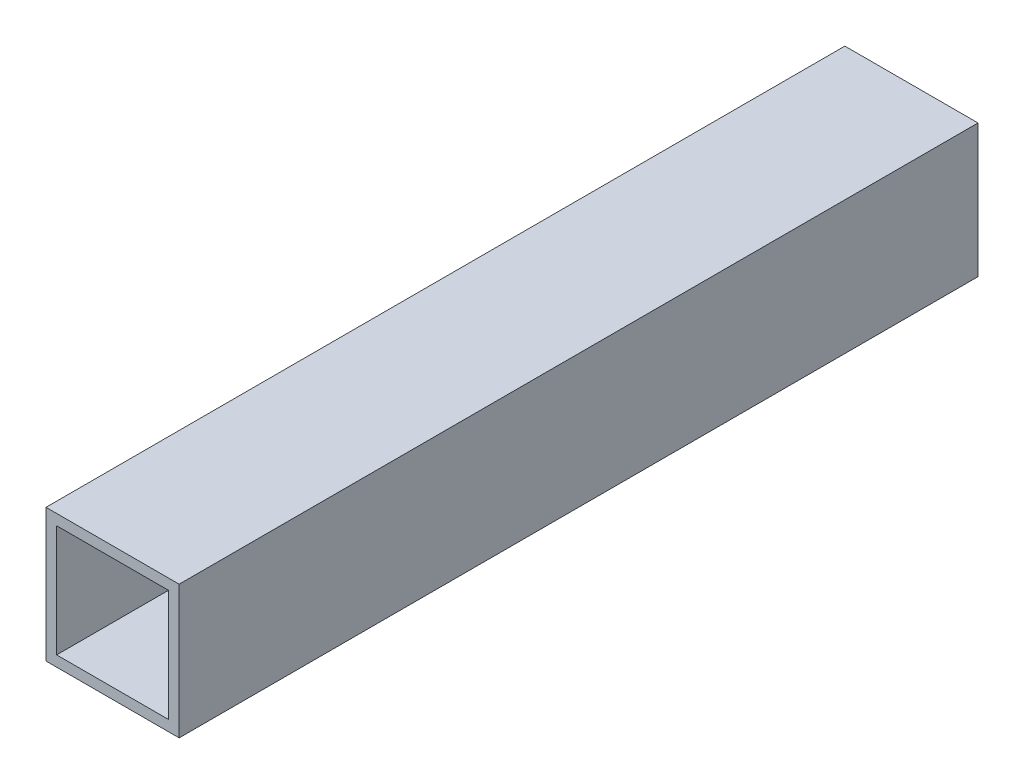
ISO-10303-21;
HEADER;
FILE_DESCRIPTION(('STEP AP214'),'2;1');
FILE_NAME('part.step','',(''),(''),'','','');
FILE_SCHEMA(('AUTOMOTIVE_DESIGN { 1 0 10303 214 1 1 1 1 }'));
ENDSEC;
DATA;
#1=APPLICATION_CONTEXT('core data for automotive mechanical design processes');
#2=APPLICATION_PROTOCOL_DEFINITION('international standard','automotive_design',2000,#1);
#3=PRODUCT_CONTEXT('',#1,'mechanical');
#4=PRODUCT('Part','Part','',(#3));
#5=PRODUCT_RELATED_PRODUCT_CATEGORY('part','',(#4));
#6=PRODUCT_DEFINITION_FORMATION('','',#4);
#7=PRODUCT_DEFINITION_CONTEXT('part definition',#1,'design');
#8=PRODUCT_DEFINITION('design','',#6,#7);
#9=PRODUCT_DEFINITION_SHAPE('','',#8);
#10=(LENGTH_UNIT() NAMED_UNIT(*) SI_UNIT(.MILLI.,.METRE.));
#11=(NAMED_UNIT(*) PLANE_ANGLE_UNIT() SI_UNIT($,.RADIAN.));
#12=(NAMED_UNIT(*) SI_UNIT($,.STERADIAN.) SOLID_ANGLE_UNIT());
#13=UNCERTAINTY_MEASURE_WITH_UNIT(LENGTH_MEASURE(1.E-05),#10,'distance_accuracy_value','');
#14=(GEOMETRIC_REPRESENTATION_CONTEXT(3) GLOBAL_UNCERTAINTY_ASSIGNED_CONTEXT((#13)) GLOBAL_UNIT_ASSIGNED_CONTEXT((#10,
#11,#12)) REPRESENTATION_CONTEXT('',''));
#15=CARTESIAN_POINT('',(0.,0.,0.));
#16=DIRECTION('',(0.,0.,1.));
#17=DIRECTION('',(1.,0.,0.));
#18=AXIS2_PLACEMENT_3D('',#15,#16,#17);
#19=CARTESIAN_POINT('',(0.,0.,150.));
#20=DIRECTION('',(0.,0.,1.));
#21=DIRECTION('',(1.,0.,0.));
#22=AXIS2_PLACEMENT_3D('',#19,#20,#21);
#23=PLANE('',#22);
#24=DIRECTION('',(0.,1.,0.));
#25=VECTOR('',#24,1.);
#26=CARTESIAN_POINT('',(12.5,12.5,150.));
#27=LINE('',#26,#25);
#28=CARTESIAN_POINT('',(12.5,-12.5,150.));
#29=VERTEX_POINT('',#28);
#30=CARTESIAN_POINT('',(12.5,12.5,150.));
#31=VERTEX_POINT('',#30);
#32=EDGE_CURVE('E159',#29,#31,#27,.T.);
#33=ORIENTED_EDGE('',*,*,#32,.T.);
#34=DIRECTION('',(-1.,0.,0.));
#35=VECTOR('',#34,1.);
#36=CARTESIAN_POINT('',(-12.5,12.5,150.));
#37=LINE('',#36,#35);
#38=CARTESIAN_POINT('',(-12.5,12.5,150.));
#39=VERTEX_POINT('',#38);
#40=EDGE_CURVE('E163',#31,#39,#37,.T.);
#41=ORIENTED_EDGE('',*,*,#40,.T.);
#42=DIRECTION('',(0.,-1.,0.));
#43=VECTOR('',#42,1.);
#44=CARTESIAN_POINT('',(-12.5,12.5,150.));
#45=LINE('',#44,#43);
#46=CARTESIAN_POINT('',(-12.5,-12.5,150.));
#47=VERTEX_POINT('',#46);
#48=EDGE_CURVE('E167',#39,#47,#45,.T.);
#49=ORIENTED_EDGE('',*,*,#48,.T.);
#50=DIRECTION('',(1.,0.,0.));
#51=VECTOR('',#50,1.);
#52=CARTESIAN_POINT('',(-12.5,-12.5,150.));
#53=LINE('',#52,#51);
#54=EDGE_CURVE('E170',#47,#29,#53,.T.);
#55=ORIENTED_EDGE('',*,*,#54,.T.);
#56=EDGE_LOOP('',(#33,#41,#49,#55));
#57=FACE_BOUND('',#56,.T.);
#58=DIRECTION('',(1.,0.,0.));
#59=VECTOR('',#58,1.);
#60=CARTESIAN_POINT('',(-10.5,-10.5,150.));
#61=LINE('',#60,#59);
#62=CARTESIAN_POINT('',(-10.5,-10.5,150.));
#63=VERTEX_POINT('',#62);
#64=CARTESIAN_POINT('',(10.5,-10.5,150.));
#65=VERTEX_POINT('',#64);
#66=EDGE_CURVE('E120',#63,#65,#61,.T.);
#67=ORIENTED_EDGE('',*,*,#66,.F.);
#68=DIRECTION('',(0.,-1.,0.));
#69=VECTOR('',#68,1.);
#70=CARTESIAN_POINT('',(-10.5,10.5,150.));
#71=LINE('',#70,#69);
#72=CARTESIAN_POINT('',(-10.5,10.5,150.));
#73=VERTEX_POINT('',#72);
#74=EDGE_CURVE('E111',#73,#63,#71,.T.);
#75=ORIENTED_EDGE('',*,*,#74,.F.);
#76=DIRECTION('',(-1.,0.,0.));
#77=VECTOR('',#76,1.);
#78=CARTESIAN_POINT('',(-10.5,10.5,150.));
#79=LINE('',#78,#77);
#80=CARTESIAN_POINT('',(10.5,10.5,150.));
#81=VERTEX_POINT('',#80);
#82=EDGE_CURVE('E137',#81,#73,#79,.T.);
#83=ORIENTED_EDGE('',*,*,#82,.F.);
#84=DIRECTION('',(0.,1.,0.));
#85=VECTOR('',#84,1.);
#86=CARTESIAN_POINT('',(10.5,10.5,150.));
#87=LINE('',#86,#85);
#88=EDGE_CURVE('E133',#65,#81,#87,.T.);
#89=ORIENTED_EDGE('',*,*,#88,.F.);
#90=EDGE_LOOP('',(#67,#75,#83,#89));
#91=FACE_BOUND('',#90,.T.);
#92=ADVANCED_FACE('F45',(#57,#91),#23,.T.);
#93=CARTESIAN_POINT('',(0.,0.,0.));
#94=DIRECTION('',(0.,0.,1.));
#95=DIRECTION('',(1.,0.,0.));
#96=AXIS2_PLACEMENT_3D('',#93,#94,#95);
#97=PLANE('',#96);
#98=DIRECTION('',(0.,1.,0.));
#99=VECTOR('',#98,1.);
#100=CARTESIAN_POINT('',(12.5,12.5,0.));
#101=LINE('',#100,#99);
#102=CARTESIAN_POINT('',(12.5,-12.5,0.));
#103=VERTEX_POINT('',#102);
#104=CARTESIAN_POINT('',(12.5,12.5,0.));
#105=VERTEX_POINT('',#104);
#106=EDGE_CURVE('E129',#103,#105,#101,.T.);
#107=ORIENTED_EDGE('',*,*,#106,.F.);
#108=DIRECTION('',(1.,0.,0.));
#109=VECTOR('',#108,1.);
#110=CARTESIAN_POINT('',(-12.5,-12.5,0.));
#111=LINE('',#110,#109);
#112=CARTESIAN_POINT('',(-12.5,-12.5,0.));
#113=VERTEX_POINT('',#112);
#114=EDGE_CURVE('E164',#113,#103,#111,.T.);
#115=ORIENTED_EDGE('',*,*,#114,.F.);
#116=DIRECTION('',(0.,-1.,0.));
#117=VECTOR('',#116,1.);
#118=CARTESIAN_POINT('',(-12.5,12.5,0.));
#119=LINE('',#118,#117);
#120=CARTESIAN_POINT('',(-12.5,12.5,0.));
#121=VERTEX_POINT('',#120);
#122=EDGE_CURVE('E180',#121,#113,#119,.T.);
#123=ORIENTED_EDGE('',*,*,#122,.F.);
#124=DIRECTION('',(-1.,0.,0.));
#125=VECTOR('',#124,1.);
#126=CARTESIAN_POINT('',(-12.5,12.5,0.));
#127=LINE('',#126,#125);
#128=EDGE_CURVE('E177',#105,#121,#127,.T.);
#129=ORIENTED_EDGE('',*,*,#128,.F.);
#130=EDGE_LOOP('',(#107,#115,#123,#129));
#131=FACE_BOUND('',#130,.T.);
#132=DIRECTION('',(0.,-1.,0.));
#133=VECTOR('',#132,1.);
#134=CARTESIAN_POINT('',(-10.5,10.5,0.));
#135=LINE('',#134,#133);
#136=CARTESIAN_POINT('',(-10.5,10.5,0.));
#137=VERTEX_POINT('',#136);
#138=CARTESIAN_POINT('',(-10.5,-10.5,0.));
#139=VERTEX_POINT('',#138);
#140=EDGE_CURVE('E69',#137,#139,#135,.T.);
#141=ORIENTED_EDGE('',*,*,#140,.T.);
#142=DIRECTION('',(1.,0.,0.));
#143=VECTOR('',#142,1.);
#144=CARTESIAN_POINT('',(-10.5,-10.5,0.));
#145=LINE('',#144,#143);
#146=CARTESIAN_POINT('',(10.5,-10.5,0.));
#147=VERTEX_POINT('',#146);
#148=EDGE_CURVE('E127',#139,#147,#145,.T.);
#149=ORIENTED_EDGE('',*,*,#148,.T.);
#150=DIRECTION('',(0.,1.,0.));
#151=VECTOR('',#150,1.);
#152=CARTESIAN_POINT('',(10.5,10.5,0.));
#153=LINE('',#152,#151);
#154=CARTESIAN_POINT('',(10.5,10.5,0.));
#155=VERTEX_POINT('',#154);
#156=EDGE_CURVE('E146',#147,#155,#153,.T.);
#157=ORIENTED_EDGE('',*,*,#156,.T.);
#158=DIRECTION('',(-1.,0.,0.));
#159=VECTOR('',#158,1.);
#160=CARTESIAN_POINT('',(-10.5,10.5,0.));
#161=LINE('',#160,#159);
#162=EDGE_CURVE('E121',#155,#137,#161,.T.);
#163=ORIENTED_EDGE('',*,*,#162,.T.);
#164=EDGE_LOOP('',(#141,#149,#157,#163));
#165=FACE_BOUND('',#164,.T.);
#166=ADVANCED_FACE('F203',(#131,#165),#97,.F.);
#167=CARTESIAN_POINT('',(12.5,12.5,150.));
#168=DIRECTION('',(-1.,0.,0.));
#169=DIRECTION('',(0.,-1.,0.));
#170=AXIS2_PLACEMENT_3D('',#167,#168,#169);
#171=PLANE('',#170);
#172=ORIENTED_EDGE('',*,*,#106,.T.);
#173=DIRECTION('',(0.,0.,-1.));
#174=VECTOR('',#173,1.);
#175=CARTESIAN_POINT('',(12.5,12.5,150.));
#176=LINE('',#175,#174);
#177=EDGE_CURVE('E11',#31,#105,#176,.T.);
#178=ORIENTED_EDGE('',*,*,#177,.F.);
#179=ORIENTED_EDGE('',*,*,#32,.F.);
#180=DIRECTION('',(0.,0.,-1.));
#181=VECTOR('',#180,1.);
#182=CARTESIAN_POINT('',(12.5,-12.5,150.));
#183=LINE('',#182,#181);
#184=EDGE_CURVE('E173',#29,#103,#183,.T.);
#185=ORIENTED_EDGE('',*,*,#184,.T.);
#186=EDGE_LOOP('',(#172,#178,#179,#185));
#187=FACE_BOUND('',#186,.T.);
#188=ADVANCED_FACE('F47',(#187),#171,.F.);
#189=CARTESIAN_POINT('',(-12.5,12.5,150.));
#190=DIRECTION('',(0.,-1.,0.));
#191=DIRECTION('',(0.,0.,-1.));
#192=AXIS2_PLACEMENT_3D('',#189,#190,#191);
#193=PLANE('',#192);
#194=ORIENTED_EDGE('',*,*,#128,.T.);
#195=DIRECTION('',(0.,0.,-1.));
#196=VECTOR('',#195,1.);
#197=CARTESIAN_POINT('',(-12.5,12.5,150.));
#198=LINE('',#197,#196);
#199=EDGE_CURVE('E54',#39,#121,#198,.T.);
#200=ORIENTED_EDGE('',*,*,#199,.F.);
#201=ORIENTED_EDGE('',*,*,#40,.F.);
#202=ORIENTED_EDGE('',*,*,#177,.T.);
#203=EDGE_LOOP('',(#194,#200,#201,#202));
#204=FACE_BOUND('',#203,.T.);
#205=ADVANCED_FACE('F213',(#204),#193,.F.);
#206=CARTESIAN_POINT('',(-12.5,12.5,150.));
#207=DIRECTION('',(1.,0.,0.));
#208=DIRECTION('',(0.,1.,0.));
#209=AXIS2_PLACEMENT_3D('',#206,#207,#208);
#210=PLANE('',#209);
#211=ORIENTED_EDGE('',*,*,#122,.T.);
#212=DIRECTION('',(0.,0.,-1.));
#213=VECTOR('',#212,1.);
#214=CARTESIAN_POINT('',(-12.5,-12.5,150.));
#215=LINE('',#214,#213);
#216=EDGE_CURVE('E188',#47,#113,#215,.T.);
#217=ORIENTED_EDGE('',*,*,#216,.F.);
#218=ORIENTED_EDGE('',*,*,#48,.F.);
#219=ORIENTED_EDGE('',*,*,#199,.T.);
#220=EDGE_LOOP('',(#211,#217,#218,#219));
#221=FACE_BOUND('',#220,.T.);
#222=ADVANCED_FACE('F197',(#221),#210,.F.);
#223=CARTESIAN_POINT('',(-12.5,-12.5,150.));
#224=DIRECTION('',(0.,1.,0.));
#225=DIRECTION('',(0.,0.,1.));
#226=AXIS2_PLACEMENT_3D('',#223,#224,#225);
#227=PLANE('',#226);
#228=ORIENTED_EDGE('',*,*,#114,.T.);
#229=ORIENTED_EDGE('',*,*,#184,.F.);
#230=ORIENTED_EDGE('',*,*,#54,.F.);
#231=ORIENTED_EDGE('',*,*,#216,.T.);
#232=EDGE_LOOP('',(#228,#229,#230,#231));
#233=FACE_BOUND('',#232,.T.);
#234=ADVANCED_FACE('F207',(#233),#227,.F.);
#235=CARTESIAN_POINT('',(-10.5,10.5,150.));
#236=DIRECTION('',(1.,0.,0.));
#237=DIRECTION('',(0.,1.,0.));
#238=AXIS2_PLACEMENT_3D('',#235,#236,#237);
#239=PLANE('',#238);
#240=ORIENTED_EDGE('',*,*,#140,.F.);
#241=DIRECTION('',(0.,0.,-1.));
#242=VECTOR('',#241,1.);
#243=CARTESIAN_POINT('',(-10.5,10.5,150.));
#244=LINE('',#243,#242);
#245=EDGE_CURVE('E115',#73,#137,#244,.T.);
#246=ORIENTED_EDGE('',*,*,#245,.F.);
#247=ORIENTED_EDGE('',*,*,#74,.T.);
#248=DIRECTION('',(0.,0.,-1.));
#249=VECTOR('',#248,1.);
#250=CARTESIAN_POINT('',(-10.5,-10.5,150.));
#251=LINE('',#250,#249);
#252=EDGE_CURVE('E114',#63,#139,#251,.T.);
#253=ORIENTED_EDGE('',*,*,#252,.T.);
#254=EDGE_LOOP('',(#240,#246,#247,#253));
#255=FACE_BOUND('',#254,.T.);
#256=ADVANCED_FACE('F113',(#255),#239,.T.);
#257=CARTESIAN_POINT('',(-10.5,-10.5,150.));
#258=DIRECTION('',(0.,1.,0.));
#259=DIRECTION('',(0.,0.,1.));
#260=AXIS2_PLACEMENT_3D('',#257,#258,#259);
#261=PLANE('',#260);
#262=ORIENTED_EDGE('',*,*,#148,.F.);
#263=ORIENTED_EDGE('',*,*,#252,.F.);
#264=ORIENTED_EDGE('',*,*,#66,.T.);
#265=DIRECTION('',(0.,0.,-1.));
#266=VECTOR('',#265,1.);
#267=CARTESIAN_POINT('',(10.5,-10.5,150.));
#268=LINE('',#267,#266);
#269=EDGE_CURVE('E130',#65,#147,#268,.T.);
#270=ORIENTED_EDGE('',*,*,#269,.T.);
#271=EDGE_LOOP('',(#262,#263,#264,#270));
#272=FACE_BOUND('',#271,.T.);
#273=ADVANCED_FACE('F124',(#272),#261,.T.);
#274=CARTESIAN_POINT('',(10.5,10.5,150.));
#275=DIRECTION('',(-1.,0.,0.));
#276=DIRECTION('',(0.,-1.,0.));
#277=AXIS2_PLACEMENT_3D('',#274,#275,#276);
#278=PLANE('',#277);
#279=ORIENTED_EDGE('',*,*,#156,.F.);
#280=ORIENTED_EDGE('',*,*,#269,.F.);
#281=ORIENTED_EDGE('',*,*,#88,.T.);
#282=DIRECTION('',(0.,0.,-1.));
#283=VECTOR('',#282,1.);
#284=CARTESIAN_POINT('',(10.5,10.5,150.));
#285=LINE('',#284,#283);
#286=EDGE_CURVE('E61',#81,#155,#285,.T.);
#287=ORIENTED_EDGE('',*,*,#286,.T.);
#288=EDGE_LOOP('',(#279,#280,#281,#287));
#289=FACE_BOUND('',#288,.T.);
#290=ADVANCED_FACE('F236',(#289),#278,.T.);
#291=CARTESIAN_POINT('',(-10.5,10.5,150.));
#292=DIRECTION('',(0.,-1.,0.));
#293=DIRECTION('',(0.,0.,-1.));
#294=AXIS2_PLACEMENT_3D('',#291,#292,#293);
#295=PLANE('',#294);
#296=ORIENTED_EDGE('',*,*,#162,.F.);
#297=ORIENTED_EDGE('',*,*,#286,.F.);
#298=ORIENTED_EDGE('',*,*,#82,.T.);
#299=ORIENTED_EDGE('',*,*,#245,.T.);
#300=EDGE_LOOP('',(#296,#297,#298,#299));
#301=FACE_BOUND('',#300,.T.);
#302=ADVANCED_FACE('F240',(#301),#295,.T.);
#303=CLOSED_SHELL('',(#92,#166,#188,#205,#222,#234,#256,#273,#290,#302));
#304=MANIFOLD_SOLID_BREP('B2',#303);
#305=ADVANCED_BREP_SHAPE_REPRESENTATION('',(#18,#304),#14);
#306=SHAPE_DEFINITION_REPRESENTATION(#9,#305);
ENDSEC;
END-ISO-10303-21;
